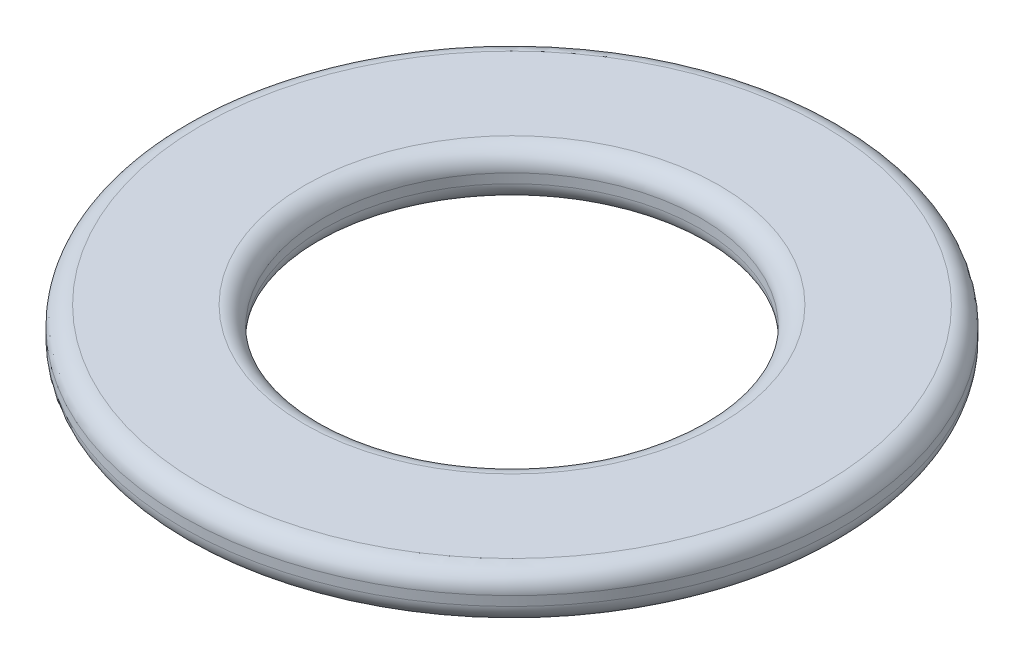
ISO-10303-21;
HEADER;
FILE_DESCRIPTION(('STEP AP214'),'2;1');
FILE_NAME('part.step','',(''),(''),'','','');
FILE_SCHEMA(('AUTOMOTIVE_DESIGN { 1 0 10303 214 1 1 1 1 }'));
ENDSEC;
DATA;
#1=APPLICATION_CONTEXT('core data for automotive mechanical design processes');
#2=APPLICATION_PROTOCOL_DEFINITION('international standard','automotive_design',2000,#1);
#3=PRODUCT_CONTEXT('',#1,'mechanical');
#4=PRODUCT('Part','Part','',(#3));
#5=PRODUCT_RELATED_PRODUCT_CATEGORY('part','',(#4));
#6=PRODUCT_DEFINITION_FORMATION('','',#4);
#7=PRODUCT_DEFINITION_CONTEXT('part definition',#1,'design');
#8=PRODUCT_DEFINITION('design','',#6,#7);
#9=PRODUCT_DEFINITION_SHAPE('','',#8);
#10=(LENGTH_UNIT() NAMED_UNIT(*) SI_UNIT(.MILLI.,.METRE.));
#11=(NAMED_UNIT(*) PLANE_ANGLE_UNIT() SI_UNIT($,.RADIAN.));
#12=(NAMED_UNIT(*) SI_UNIT($,.STERADIAN.) SOLID_ANGLE_UNIT());
#13=UNCERTAINTY_MEASURE_WITH_UNIT(LENGTH_MEASURE(1.E-05),#10,'distance_accuracy_value','');
#14=(GEOMETRIC_REPRESENTATION_CONTEXT(3) GLOBAL_UNCERTAINTY_ASSIGNED_CONTEXT((#13)) GLOBAL_UNIT_ASSIGNED_CONTEXT((#10,
#11,#12)) REPRESENTATION_CONTEXT('',''));
#15=CARTESIAN_POINT('',(0.,0.,0.));
#16=DIRECTION('',(0.,0.,1.));
#17=DIRECTION('',(1.,0.,0.));
#18=AXIS2_PLACEMENT_3D('',#15,#16,#17);
#19=CARTESIAN_POINT('',(0.,1.27,0.));
#20=DIRECTION('',(0.,1.,0.));
#21=DIRECTION('',(0.,0.,1.));
#22=AXIS2_PLACEMENT_3D('',#19,#20,#21);
#23=PLANE('',#22);
#24=CARTESIAN_POINT('',(0.,1.27,0.));
#25=DIRECTION('',(0.,1.,0.));
#26=DIRECTION('',(0.,0.,1.));
#27=AXIS2_PLACEMENT_3D('',#24,#25,#26);
#28=CIRCLE('',#27,5.588);
#29=CARTESIAN_POINT('',(0.,1.27,5.588));
#30=VERTEX_POINT('',#29);
#31=EDGE_CURVE('E10',#30,#30,#28,.F.);
#32=ORIENTED_EDGE('',*,*,#31,.T.);
#33=EDGE_LOOP('',(#32));
#34=FACE_BOUND('',#33,.T.);
#35=CARTESIAN_POINT('',(0.,1.27,0.));
#36=DIRECTION('',(0.,1.,0.));
#37=DIRECTION('',(0.,0.,1.));
#38=AXIS2_PLACEMENT_3D('',#35,#36,#37);
#39=CIRCLE('',#38,8.382);
#40=CARTESIAN_POINT('',(0.,1.27,8.382));
#41=VERTEX_POINT('',#40);
#42=EDGE_CURVE('E49',#41,#41,#39,.T.);
#43=ORIENTED_EDGE('',*,*,#42,.T.);
#44=EDGE_LOOP('',(#43));
#45=FACE_BOUND('',#44,.T.);
#46=ADVANCED_FACE('F41',(#34,#45),#23,.T.);
#47=CARTESIAN_POINT('',(0.,0.,0.));
#48=DIRECTION('',(0.,1.,0.));
#49=DIRECTION('',(0.,0.,1.));
#50=AXIS2_PLACEMENT_3D('',#47,#48,#49);
#51=PLANE('',#50);
#52=CARTESIAN_POINT('',(0.,0.,0.));
#53=DIRECTION('',(0.,1.,0.));
#54=DIRECTION('',(0.,0.,1.));
#55=AXIS2_PLACEMENT_3D('',#52,#53,#54);
#56=CIRCLE('',#55,5.588);
#57=CARTESIAN_POINT('',(0.,0.,5.588));
#58=VERTEX_POINT('',#57);
#59=EDGE_CURVE('E73',#58,#58,#56,.T.);
#60=ORIENTED_EDGE('',*,*,#59,.T.);
#61=EDGE_LOOP('',(#60));
#62=FACE_BOUND('',#61,.T.);
#63=CARTESIAN_POINT('',(0.,0.,0.));
#64=DIRECTION('',(0.,1.,0.));
#65=DIRECTION('',(0.,0.,1.));
#66=AXIS2_PLACEMENT_3D('',#63,#64,#65);
#67=CIRCLE('',#66,8.382);
#68=CARTESIAN_POINT('',(0.,0.,8.382));
#69=VERTEX_POINT('',#68);
#70=EDGE_CURVE('E77',#69,#69,#67,.F.);
#71=ORIENTED_EDGE('',*,*,#70,.T.);
#72=EDGE_LOOP('',(#71));
#73=FACE_BOUND('',#72,.T.);
#74=ADVANCED_FACE('F82',(#62,#73),#51,.F.);
#75=CARTESIAN_POINT('',(0.,1.27,0.));
#76=DIRECTION('',(0.,-1.,0.));
#77=DIRECTION('',(0.,0.,-1.));
#78=AXIS2_PLACEMENT_3D('',#75,#76,#77);
#79=CYLINDRICAL_SURFACE('',#78,8.89);
#80=CARTESIAN_POINT('',(0.,0.508,0.));
#81=DIRECTION('',(0.,1.,0.));
#82=DIRECTION('',(0.,0.,1.));
#83=AXIS2_PLACEMENT_3D('',#80,#81,#82);
#84=CIRCLE('',#83,8.89);
#85=CARTESIAN_POINT('',(0.,0.508,8.89));
#86=VERTEX_POINT('',#85);
#87=EDGE_CURVE('E54',#86,#86,#84,.T.);
#88=ORIENTED_EDGE('',*,*,#87,.T.);
#89=EDGE_LOOP('',(#88));
#90=FACE_BOUND('',#89,.T.);
#91=CARTESIAN_POINT('',(0.,0.762,0.));
#92=DIRECTION('',(0.,1.,0.));
#93=DIRECTION('',(0.,0.,1.));
#94=AXIS2_PLACEMENT_3D('',#91,#92,#93);
#95=CIRCLE('',#94,8.89);
#96=CARTESIAN_POINT('',(0.,0.762,8.89));
#97=VERTEX_POINT('',#96);
#98=EDGE_CURVE('E59',#97,#97,#95,.F.);
#99=ORIENTED_EDGE('',*,*,#98,.T.);
#100=EDGE_LOOP('',(#99));
#101=FACE_BOUND('',#100,.T.);
#102=ADVANCED_FACE('F92',(#90,#101),#79,.T.);
#103=CARTESIAN_POINT('',(0.,1.27,0.));
#104=DIRECTION('',(0.,-1.,0.));
#105=DIRECTION('',(0.,0.,-1.));
#106=AXIS2_PLACEMENT_3D('',#103,#104,#105);
#107=CYLINDRICAL_SURFACE('',#106,5.08);
#108=CARTESIAN_POINT('',(0.,0.508,0.));
#109=DIRECTION('',(0.,1.,0.));
#110=DIRECTION('',(0.,0.,1.));
#111=AXIS2_PLACEMENT_3D('',#108,#109,#110);
#112=CIRCLE('',#111,5.08);
#113=CARTESIAN_POINT('',(0.,0.508,5.08));
#114=VERTEX_POINT('',#113);
#115=EDGE_CURVE('E65',#114,#114,#112,.F.);
#116=ORIENTED_EDGE('',*,*,#115,.T.);
#117=EDGE_LOOP('',(#116));
#118=FACE_BOUND('',#117,.T.);
#119=CARTESIAN_POINT('',(0.,0.762,0.));
#120=DIRECTION('',(0.,1.,0.));
#121=DIRECTION('',(0.,0.,1.));
#122=AXIS2_PLACEMENT_3D('',#119,#120,#121);
#123=CIRCLE('',#122,5.08);
#124=CARTESIAN_POINT('',(0.,0.762,5.08));
#125=VERTEX_POINT('',#124);
#126=EDGE_CURVE('E69',#125,#125,#123,.T.);
#127=ORIENTED_EDGE('',*,*,#126,.T.);
#128=EDGE_LOOP('',(#127));
#129=FACE_BOUND('',#128,.T.);
#130=ADVANCED_FACE('F95',(#118,#129),#107,.F.);
#131=CARTESIAN_POINT('',(0.,0.508,0.));
#132=DIRECTION('',(0.,1.,0.));
#133=DIRECTION('',(0.,0.,1.));
#134=AXIS2_PLACEMENT_3D('',#131,#132,#133);
#135=TOROIDAL_SURFACE('',#134,5.588,0.508);
#136=ORIENTED_EDGE('',*,*,#115,.F.);
#137=EDGE_LOOP('',(#136));
#138=FACE_BOUND('',#137,.T.);
#139=ORIENTED_EDGE('',*,*,#59,.F.);
#140=EDGE_LOOP('',(#139));
#141=FACE_BOUND('',#140,.T.);
#142=ADVANCED_FACE('F88',(#138,#141),#135,.T.);
#143=CARTESIAN_POINT('',(0.,0.508,0.));
#144=DIRECTION('',(0.,1.,0.));
#145=DIRECTION('',(0.,0.,1.));
#146=AXIS2_PLACEMENT_3D('',#143,#144,#145);
#147=TOROIDAL_SURFACE('',#146,8.382,0.508);
#148=ORIENTED_EDGE('',*,*,#70,.F.);
#149=EDGE_LOOP('',(#148));
#150=FACE_BOUND('',#149,.T.);
#151=ORIENTED_EDGE('',*,*,#87,.F.);
#152=EDGE_LOOP('',(#151));
#153=FACE_BOUND('',#152,.T.);
#154=ADVANCED_FACE('F84',(#150,#153),#147,.T.);
#155=CARTESIAN_POINT('',(0.,0.762,0.));
#156=DIRECTION('',(0.,1.,0.));
#157=DIRECTION('',(0.,0.,1.));
#158=AXIS2_PLACEMENT_3D('',#155,#156,#157);
#159=TOROIDAL_SURFACE('',#158,5.588,0.508);
#160=ORIENTED_EDGE('',*,*,#31,.F.);
#161=EDGE_LOOP('',(#160));
#162=FACE_BOUND('',#161,.T.);
#163=ORIENTED_EDGE('',*,*,#126,.F.);
#164=EDGE_LOOP('',(#163));
#165=FACE_BOUND('',#164,.T.);
#166=ADVANCED_FACE('F87',(#162,#165),#159,.T.);
#167=CARTESIAN_POINT('',(0.,0.762,0.));
#168=DIRECTION('',(0.,1.,0.));
#169=DIRECTION('',(0.,0.,1.));
#170=AXIS2_PLACEMENT_3D('',#167,#168,#169);
#171=TOROIDAL_SURFACE('',#170,8.382,0.508);
#172=ORIENTED_EDGE('',*,*,#98,.F.);
#173=EDGE_LOOP('',(#172));
#174=FACE_BOUND('',#173,.T.);
#175=ORIENTED_EDGE('',*,*,#42,.F.);
#176=EDGE_LOOP('',(#175));
#177=FACE_BOUND('',#176,.T.);
#178=ADVANCED_FACE('F43',(#174,#177),#171,.T.);
#179=CLOSED_SHELL('',(#46,#74,#102,#130,#142,#154,#166,#178));
#180=MANIFOLD_SOLID_BREP('B2',#179);
#181=ADVANCED_BREP_SHAPE_REPRESENTATION('',(#18,#180),#14);
#182=SHAPE_DEFINITION_REPRESENTATION(#9,#181);
ENDSEC;
END-ISO-10303-21;
